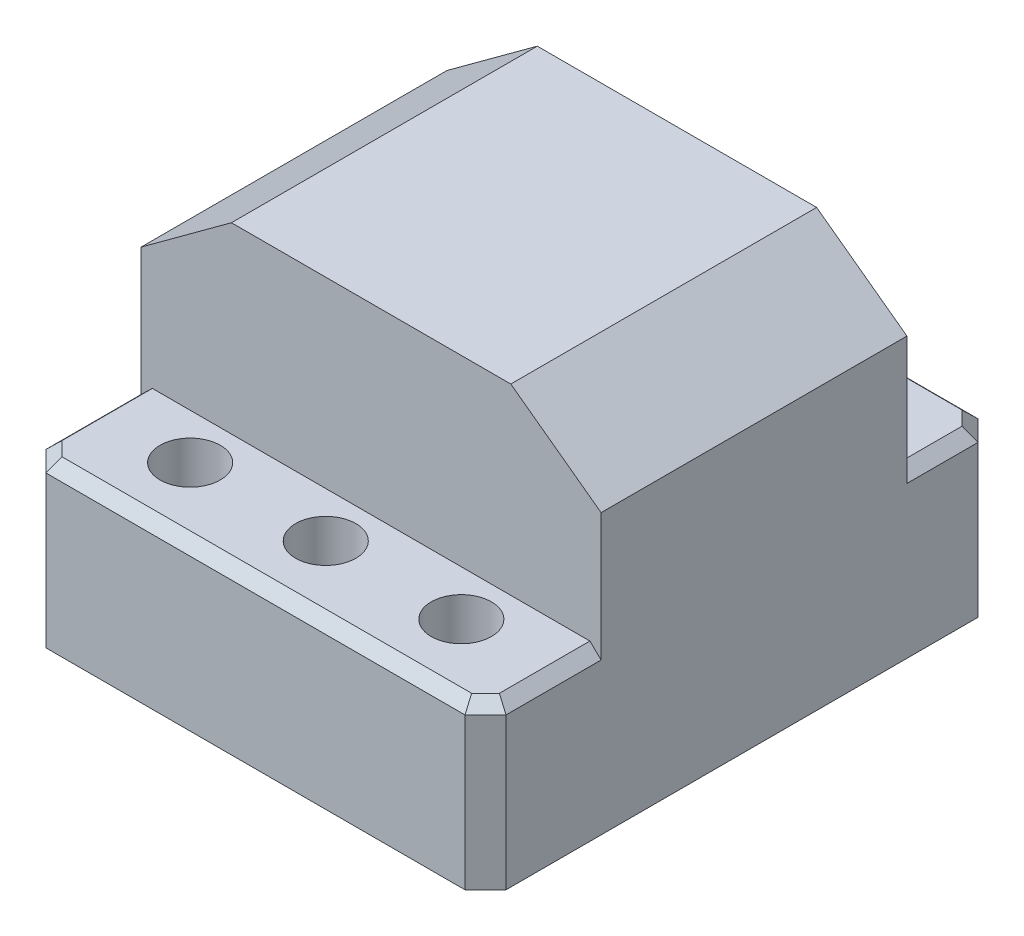
ISO-10303-21;
HEADER;
FILE_DESCRIPTION(('STEP AP214'),'2;1');
FILE_NAME('part.step','',(''),(''),'','','');
FILE_SCHEMA(('AUTOMOTIVE_DESIGN { 1 0 10303 214 1 1 1 1 }'));
ENDSEC;
DATA;
#1=APPLICATION_CONTEXT('core data for automotive mechanical design processes');
#2=APPLICATION_PROTOCOL_DEFINITION('international standard','automotive_design',2000,#1);
#3=PRODUCT_CONTEXT('',#1,'mechanical');
#4=PRODUCT('Part','Part','',(#3));
#5=PRODUCT_RELATED_PRODUCT_CATEGORY('part','',(#4));
#6=PRODUCT_DEFINITION_FORMATION('','',#4);
#7=PRODUCT_DEFINITION_CONTEXT('part definition',#1,'design');
#8=PRODUCT_DEFINITION('design','',#6,#7);
#9=PRODUCT_DEFINITION_SHAPE('','',#8);
#10=(LENGTH_UNIT() NAMED_UNIT(*) SI_UNIT(.MILLI.,.METRE.));
#11=(NAMED_UNIT(*) PLANE_ANGLE_UNIT() SI_UNIT($,.RADIAN.));
#12=(NAMED_UNIT(*) SI_UNIT($,.STERADIAN.) SOLID_ANGLE_UNIT());
#13=UNCERTAINTY_MEASURE_WITH_UNIT(LENGTH_MEASURE(1.E-05),#10,'distance_accuracy_value','');
#14=(GEOMETRIC_REPRESENTATION_CONTEXT(3) GLOBAL_UNCERTAINTY_ASSIGNED_CONTEXT((#13)) GLOBAL_UNIT_ASSIGNED_CONTEXT((#10,
#11,#12)) REPRESENTATION_CONTEXT('',''));
#15=CARTESIAN_POINT('',(0.,0.,0.));
#16=DIRECTION('',(0.,0.,1.));
#17=DIRECTION('',(1.,0.,0.));
#18=AXIS2_PLACEMENT_3D('',#15,#16,#17);
#19=CARTESIAN_POINT('',(0.,17.1196,0.));
#20=DIRECTION('',(0.,1.,0.));
#21=DIRECTION('',(0.,0.,1.));
#22=AXIS2_PLACEMENT_3D('',#19,#20,#21);
#23=PLANE('',#22);
#24=DIRECTION('',(-1.,0.,0.));
#25=VECTOR('',#24,1.);
#26=CARTESIAN_POINT('',(0.,17.1196,9.652));
#27=LINE('',#26,#25);
#28=CARTESIAN_POINT('',(47.3303888513374,17.1196,9.652));
#29=VERTEX_POINT('',#28);
#30=CARTESIAN_POINT('',(1.18361114866263,17.1196,9.652));
#31=VERTEX_POINT('',#30);
#32=EDGE_CURVE('E206',#29,#31,#27,.T.);
#33=ORIENTED_EDGE('',*,*,#32,.F.);
#34=DIRECTION('',(0.,0.,-1.));
#35=VECTOR('',#34,1.);
#36=CARTESIAN_POINT('',(47.3303888513374,17.1196,2.159));
#37=LINE('',#36,#35);
#38=CARTESIAN_POINT('',(47.3303888513374,17.1196,2.64926779035206));
#39=VERTEX_POINT('',#38);
#40=EDGE_CURVE('E281',#29,#39,#37,.T.);
#41=ORIENTED_EDGE('',*,*,#40,.T.);
#42=DIRECTION('',(-0.707106781186549,0.,-0.707106781186546));
#43=VECTOR('',#42,1.);
#44=CARTESIAN_POINT('',(22.3405605304926,17.1196,-22.3405605304926));
#45=LINE('',#44,#43);
#46=CARTESIAN_POINT('',(45.8647322096479,17.1196,1.18361114866263));
#47=VERTEX_POINT('',#46);
#48=EDGE_CURVE('E279',#39,#47,#45,.T.);
#49=ORIENTED_EDGE('',*,*,#48,.T.);
#50=DIRECTION('',(-1.,0.,0.));
#51=VECTOR('',#50,1.);
#52=CARTESIAN_POINT('',(2.159,17.1196,1.18361114866263));
#53=LINE('',#52,#51);
#54=CARTESIAN_POINT('',(2.64926779035206,17.1196,1.18361114866263));
#55=VERTEX_POINT('',#54);
#56=EDGE_CURVE('E277',#47,#55,#53,.T.);
#57=ORIENTED_EDGE('',*,*,#56,.T.);
#58=DIRECTION('',(-0.707106781186546,0.,0.707106781186549));
#59=VECTOR('',#58,1.);
#60=CARTESIAN_POINT('',(1.91643946950735,17.1196,1.91643946950735));
#61=LINE('',#60,#59);
#62=CARTESIAN_POINT('',(1.18361114866263,17.1196,2.64926779035207));
#63=VERTEX_POINT('',#62);
#64=EDGE_CURVE('E275',#55,#63,#61,.T.);
#65=ORIENTED_EDGE('',*,*,#64,.T.);
#66=DIRECTION('',(0.,0.,1.));
#67=VECTOR('',#66,1.);
#68=CARTESIAN_POINT('',(1.18361114866263,17.1196,9.652));
#69=LINE('',#68,#67);
#70=EDGE_CURVE('E273',#63,#31,#69,.T.);
#71=ORIENTED_EDGE('',*,*,#70,.T.);
#72=EDGE_LOOP('',(#33,#41,#49,#57,#65,#71));
#73=FACE_BOUND('',#72,.T.);
#74=ADVANCED_FACE('F37',(#73),#23,.T.);
#75=CARTESIAN_POINT('',(0.,17.1196,0.));
#76=DIRECTION('',(1.,0.,0.));
#77=DIRECTION('',(0.,0.,-1.));
#78=AXIS2_PLACEMENT_3D('',#75,#76,#77);
#79=PLANE('',#78);
#80=DIRECTION('',(0.,-1.,0.));
#81=VECTOR('',#80,1.);
#82=CARTESIAN_POINT('',(0.,36.4236,9.652));
#83=LINE('',#82,#81);
#84=CARTESIAN_POINT('',(0.,29.4386,9.652));
#85=VERTEX_POINT('',#84);
#86=CARTESIAN_POINT('',(0.,15.9766,9.652));
#87=VERTEX_POINT('',#86);
#88=EDGE_CURVE('E208',#85,#87,#83,.T.);
#89=ORIENTED_EDGE('',*,*,#88,.T.);
#90=DIRECTION('',(0.,0.,-1.));
#91=VECTOR('',#90,1.);
#92=CARTESIAN_POINT('',(0.,15.9766,2.15900000000001));
#93=LINE('',#92,#91);
#94=CARTESIAN_POINT('',(0.,15.9766,2.15900000000001));
#95=VERTEX_POINT('',#94);
#96=EDGE_CURVE('E298',#87,#95,#93,.T.);
#97=ORIENTED_EDGE('',*,*,#96,.T.);
#98=DIRECTION('',(0.,-1.,0.));
#99=VECTOR('',#98,1.);
#100=CARTESIAN_POINT('',(0.,17.1196,2.15900000000001));
#101=LINE('',#100,#99);
#102=CARTESIAN_POINT('',(0.,0.,2.15900000000001));
#103=VERTEX_POINT('',#102);
#104=EDGE_CURVE('E249',#95,#103,#101,.T.);
#105=ORIENTED_EDGE('',*,*,#104,.T.);
#106=DIRECTION('',(0.,0.,1.));
#107=VECTOR('',#106,1.);
#108=CARTESIAN_POINT('',(0.,0.,0.));
#109=LINE('',#108,#107);
#110=CARTESIAN_POINT('',(0.,0.,51.943));
#111=VERTEX_POINT('',#110);
#112=EDGE_CURVE('E227',#103,#111,#109,.T.);
#113=ORIENTED_EDGE('',*,*,#112,.T.);
#114=DIRECTION('',(0.,1.,0.));
#115=VECTOR('',#114,1.);
#116=CARTESIAN_POINT('',(0.,17.1196,51.943));
#117=LINE('',#116,#115);
#118=CARTESIAN_POINT('',(0.,15.9766,51.943));
#119=VERTEX_POINT('',#118);
#120=EDGE_CURVE('E246',#111,#119,#117,.T.);
#121=ORIENTED_EDGE('',*,*,#120,.T.);
#122=DIRECTION('',(0.,0.,-1.));
#123=VECTOR('',#122,1.);
#124=CARTESIAN_POINT('',(0.,15.9766,41.91));
#125=LINE('',#124,#123);
#126=CARTESIAN_POINT('',(0.,15.9766,41.91));
#127=VERTEX_POINT('',#126);
#128=EDGE_CURVE('E295',#119,#127,#125,.T.);
#129=ORIENTED_EDGE('',*,*,#128,.T.);
#130=DIRECTION('',(0.,-1.,0.));
#131=VECTOR('',#130,1.);
#132=CARTESIAN_POINT('',(0.,36.4236,41.91));
#133=LINE('',#132,#131);
#134=CARTESIAN_POINT('',(0.,29.4386,41.91));
#135=VERTEX_POINT('',#134);
#136=EDGE_CURVE('E225',#135,#127,#133,.T.);
#137=ORIENTED_EDGE('',*,*,#136,.F.);
#138=DIRECTION('',(0.,0.,-1.));
#139=VECTOR('',#138,1.);
#140=CARTESIAN_POINT('',(0.,29.4386,9.652));
#141=LINE('',#140,#139);
#142=EDGE_CURVE('E184',#135,#85,#141,.T.);
#143=ORIENTED_EDGE('',*,*,#142,.T.);
#144=EDGE_LOOP('',(#89,#97,#105,#113,#121,#129,#137,#143));
#145=FACE_BOUND('',#144,.T.);
#146=ADVANCED_FACE('F370',(#145),#79,.F.);
#147=CARTESIAN_POINT('',(0.,17.1196,54.102));
#148=DIRECTION('',(0.,0.,-1.));
#149=DIRECTION('',(-1.,0.,0.));
#150=AXIS2_PLACEMENT_3D('',#147,#148,#149);
#151=PLANE('',#150);
#152=DIRECTION('',(0.,1.,0.));
#153=VECTOR('',#152,1.);
#154=CARTESIAN_POINT('',(46.355,17.1196,54.102));
#155=LINE('',#154,#153);
#156=CARTESIAN_POINT('',(46.355,0.,54.102));
#157=VERTEX_POINT('',#156);
#158=CARTESIAN_POINT('',(46.355,15.9766,54.102));
#159=VERTEX_POINT('',#158);
#160=EDGE_CURVE('E271',#157,#159,#155,.T.);
#161=ORIENTED_EDGE('',*,*,#160,.T.);
#162=DIRECTION('',(-1.,0.,0.));
#163=VECTOR('',#162,1.);
#164=CARTESIAN_POINT('',(2.159,15.9766,54.102));
#165=LINE('',#164,#163);
#166=CARTESIAN_POINT('',(2.159,15.9766,54.102));
#167=VERTEX_POINT('',#166);
#168=EDGE_CURVE('E62',#159,#167,#165,.T.);
#169=ORIENTED_EDGE('',*,*,#168,.T.);
#170=DIRECTION('',(0.,-1.,0.));
#171=VECTOR('',#170,1.);
#172=CARTESIAN_POINT('',(2.159,17.1196,54.102));
#173=LINE('',#172,#171);
#174=CARTESIAN_POINT('',(2.159,0.,54.102));
#175=VERTEX_POINT('',#174);
#176=EDGE_CURVE('E269',#167,#175,#173,.T.);
#177=ORIENTED_EDGE('',*,*,#176,.T.);
#178=DIRECTION('',(1.,0.,0.));
#179=VECTOR('',#178,1.);
#180=CARTESIAN_POINT('',(0.,0.,54.102));
#181=LINE('',#180,#179);
#182=EDGE_CURVE('E230',#175,#157,#181,.T.);
#183=ORIENTED_EDGE('',*,*,#182,.T.);
#184=EDGE_LOOP('',(#161,#169,#177,#183));
#185=FACE_BOUND('',#184,.T.);
#186=ADVANCED_FACE('F380',(#185),#151,.F.);
#187=CARTESIAN_POINT('',(48.514,17.1196,0.));
#188=DIRECTION('',(-1.,0.,0.));
#189=DIRECTION('',(0.,0.,1.));
#190=AXIS2_PLACEMENT_3D('',#187,#188,#189);
#191=PLANE('',#190);
#192=DIRECTION('',(0.,1.,0.));
#193=VECTOR('',#192,1.);
#194=CARTESIAN_POINT('',(48.514,17.1196,2.159));
#195=LINE('',#194,#193);
#196=CARTESIAN_POINT('',(48.514,0.,2.159));
#197=VERTEX_POINT('',#196);
#198=CARTESIAN_POINT('',(48.514,15.9766,2.159));
#199=VERTEX_POINT('',#198);
#200=EDGE_CURVE('E266',#197,#199,#195,.T.);
#201=ORIENTED_EDGE('',*,*,#200,.T.);
#202=DIRECTION('',(0.,0.,1.));
#203=VECTOR('',#202,1.);
#204=CARTESIAN_POINT('',(48.514,15.9766,9.652));
#205=LINE('',#204,#203);
#206=CARTESIAN_POINT('',(48.514,15.9766,9.652));
#207=VERTEX_POINT('',#206);
#208=EDGE_CURVE('E286',#199,#207,#205,.T.);
#209=ORIENTED_EDGE('',*,*,#208,.T.);
#210=DIRECTION('',(0.,-1.,0.));
#211=VECTOR('',#210,1.);
#212=CARTESIAN_POINT('',(48.514,36.4236,9.652));
#213=LINE('',#212,#211);
#214=CARTESIAN_POINT('',(48.514,29.4386,9.652));
#215=VERTEX_POINT('',#214);
#216=EDGE_CURVE('E221',#215,#207,#213,.T.);
#217=ORIENTED_EDGE('',*,*,#216,.F.);
#218=DIRECTION('',(0.,0.,1.));
#219=VECTOR('',#218,1.);
#220=CARTESIAN_POINT('',(48.514,29.4386,41.91));
#221=LINE('',#220,#219);
#222=CARTESIAN_POINT('',(48.514,29.4386,41.91));
#223=VERTEX_POINT('',#222);
#224=EDGE_CURVE('E189',#215,#223,#221,.T.);
#225=ORIENTED_EDGE('',*,*,#224,.T.);
#226=DIRECTION('',(0.,-1.,0.));
#227=VECTOR('',#226,1.);
#228=CARTESIAN_POINT('',(48.514,36.4236,41.91));
#229=LINE('',#228,#227);
#230=CARTESIAN_POINT('',(48.514,15.9766,41.91));
#231=VERTEX_POINT('',#230);
#232=EDGE_CURVE('E223',#223,#231,#229,.T.);
#233=ORIENTED_EDGE('',*,*,#232,.T.);
#234=DIRECTION('',(0.,0.,1.));
#235=VECTOR('',#234,1.);
#236=CARTESIAN_POINT('',(48.514,15.9766,51.943));
#237=LINE('',#236,#235);
#238=CARTESIAN_POINT('',(48.514,15.9766,51.943));
#239=VERTEX_POINT('',#238);
#240=EDGE_CURVE('E284',#231,#239,#237,.T.);
#241=ORIENTED_EDGE('',*,*,#240,.T.);
#242=DIRECTION('',(0.,-1.,0.));
#243=VECTOR('',#242,1.);
#244=CARTESIAN_POINT('',(48.514,17.1196,51.943));
#245=LINE('',#244,#243);
#246=CARTESIAN_POINT('',(48.514,0.,51.943));
#247=VERTEX_POINT('',#246);
#248=EDGE_CURVE('E264',#239,#247,#245,.T.);
#249=ORIENTED_EDGE('',*,*,#248,.T.);
#250=DIRECTION('',(0.,0.,-1.));
#251=VECTOR('',#250,1.);
#252=CARTESIAN_POINT('',(48.514,0.,0.));
#253=LINE('',#252,#251);
#254=EDGE_CURVE('E233',#247,#197,#253,.T.);
#255=ORIENTED_EDGE('',*,*,#254,.T.);
#256=EDGE_LOOP('',(#201,#209,#217,#225,#233,#241,#249,#255));
#257=FACE_BOUND('',#256,.T.);
#258=ADVANCED_FACE('F385',(#257),#191,.F.);
#259=CARTESIAN_POINT('',(0.,17.1196,0.));
#260=DIRECTION('',(0.,0.,1.));
#261=DIRECTION('',(1.,0.,0.));
#262=AXIS2_PLACEMENT_3D('',#259,#260,#261);
#263=PLANE('',#262);
#264=DIRECTION('',(0.,1.,0.));
#265=VECTOR('',#264,1.);
#266=CARTESIAN_POINT('',(2.159,17.1196,0.));
#267=LINE('',#266,#265);
#268=CARTESIAN_POINT('',(2.159,0.,0.));
#269=VERTEX_POINT('',#268);
#270=CARTESIAN_POINT('',(2.159,15.9766,0.));
#271=VERTEX_POINT('',#270);
#272=EDGE_CURVE('E261',#269,#271,#267,.T.);
#273=ORIENTED_EDGE('',*,*,#272,.T.);
#274=DIRECTION('',(1.,0.,0.));
#275=VECTOR('',#274,1.);
#276=CARTESIAN_POINT('',(46.355,15.9766,0.));
#277=LINE('',#276,#275);
#278=CARTESIAN_POINT('',(46.355,15.9766,0.));
#279=VERTEX_POINT('',#278);
#280=EDGE_CURVE('E291',#271,#279,#277,.T.);
#281=ORIENTED_EDGE('',*,*,#280,.T.);
#282=DIRECTION('',(0.,-1.,0.));
#283=VECTOR('',#282,1.);
#284=CARTESIAN_POINT('',(46.355,17.1196,0.));
#285=LINE('',#284,#283);
#286=CARTESIAN_POINT('',(46.355,0.,0.));
#287=VERTEX_POINT('',#286);
#288=EDGE_CURVE('E259',#279,#287,#285,.T.);
#289=ORIENTED_EDGE('',*,*,#288,.T.);
#290=DIRECTION('',(-1.,0.,0.));
#291=VECTOR('',#290,1.);
#292=CARTESIAN_POINT('',(0.,0.,0.));
#293=LINE('',#292,#291);
#294=EDGE_CURVE('E201',#287,#269,#293,.T.);
#295=ORIENTED_EDGE('',*,*,#294,.T.);
#296=EDGE_LOOP('',(#273,#281,#289,#295));
#297=FACE_BOUND('',#296,.T.);
#298=ADVANCED_FACE('F426',(#297),#263,.F.);
#299=CARTESIAN_POINT('',(38.5572,17.1196,46.6953888513374));
#300=DIRECTION('',(0.,1.,0.));
#301=DIRECTION('',(0.,0.,1.));
#302=AXIS2_PLACEMENT_3D('',#299,#300,#301);
#303=CIRCLE('',#302,3.175);
#304=CARTESIAN_POINT('',(38.5572,17.1196,49.8703888513374));
#305=VERTEX_POINT('',#304);
#306=EDGE_CURVE('E486',#305,#305,#303,.T.);
#307=ORIENTED_EDGE('',*,*,#306,.F.);
#308=EDGE_LOOP('',(#307));
#309=FACE_BOUND('',#308,.T.);
#310=CARTESIAN_POINT('',(9.9568,17.1196,46.6953888513374));
#311=DIRECTION('',(0.,1.,0.));
#312=DIRECTION('',(0.,0.,1.));
#313=AXIS2_PLACEMENT_3D('',#310,#311,#312);
#314=CIRCLE('',#313,3.175);
#315=CARTESIAN_POINT('',(9.9568,17.1196,49.8703888513374));
#316=VERTEX_POINT('',#315);
#317=EDGE_CURVE('E493',#316,#316,#314,.T.);
#318=ORIENTED_EDGE('',*,*,#317,.F.);
#319=EDGE_LOOP('',(#318));
#320=FACE_BOUND('',#319,.T.);
#321=CARTESIAN_POINT('',(24.257,17.1196,46.6953888513374));
#322=DIRECTION('',(0.,1.,0.));
#323=DIRECTION('',(0.,0.,1.));
#324=AXIS2_PLACEMENT_3D('',#321,#322,#323);
#325=CIRCLE('',#324,3.175);
#326=CARTESIAN_POINT('',(24.257,17.1196,49.8703888513374));
#327=VERTEX_POINT('',#326);
#328=EDGE_CURVE('E214',#327,#327,#325,.T.);
#329=ORIENTED_EDGE('',*,*,#328,.F.);
#330=EDGE_LOOP('',(#329));
#331=FACE_BOUND('',#330,.T.);
#332=DIRECTION('',(1.,0.,0.));
#333=VECTOR('',#332,1.);
#334=CARTESIAN_POINT('',(0.,17.1196,41.91));
#335=LINE('',#334,#333);
#336=CARTESIAN_POINT('',(1.18361114866263,17.1196,41.91));
#337=VERTEX_POINT('',#336);
#338=CARTESIAN_POINT('',(47.3303888513374,17.1196,41.91));
#339=VERTEX_POINT('',#338);
#340=EDGE_CURVE('E211',#337,#339,#335,.T.);
#341=ORIENTED_EDGE('',*,*,#340,.F.);
#342=DIRECTION('',(0.,0.,1.));
#343=VECTOR('',#342,1.);
#344=CARTESIAN_POINT('',(1.18361114866263,17.1196,51.943));
#345=LINE('',#344,#343);
#346=CARTESIAN_POINT('',(1.18361114866263,17.1196,51.4527322096479));
#347=VERTEX_POINT('',#346);
#348=EDGE_CURVE('E308',#337,#347,#345,.T.);
#349=ORIENTED_EDGE('',*,*,#348,.T.);
#350=DIRECTION('',(0.707106781186546,0.,0.707106781186549));
#351=VECTOR('',#350,1.);
#352=CARTESIAN_POINT('',(-25.1345605304927,17.1196,25.1345605304926));
#353=LINE('',#352,#351);
#354=CARTESIAN_POINT('',(2.64926779035206,17.1196,52.9183888513374));
#355=VERTEX_POINT('',#354);
#356=EDGE_CURVE('E306',#347,#355,#353,.T.);
#357=ORIENTED_EDGE('',*,*,#356,.T.);
#358=DIRECTION('',(1.,0.,0.));
#359=VECTOR('',#358,1.);
#360=CARTESIAN_POINT('',(46.355,17.1196,52.9183888513374));
#361=LINE('',#360,#359);
#362=CARTESIAN_POINT('',(45.8647322096479,17.1196,52.9183888513374));
#363=VERTEX_POINT('',#362);
#364=EDGE_CURVE('E304',#355,#363,#361,.T.);
#365=ORIENTED_EDGE('',*,*,#364,.T.);
#366=DIRECTION('',(0.707106781186548,0.,-0.707106781186548));
#367=VECTOR('',#366,1.);
#368=CARTESIAN_POINT('',(49.3915605304927,17.1196,49.3915605304927));
#369=LINE('',#368,#367);
#370=CARTESIAN_POINT('',(47.3303888513374,17.1196,51.4527322096479));
#371=VERTEX_POINT('',#370);
#372=EDGE_CURVE('E302',#363,#371,#369,.T.);
#373=ORIENTED_EDGE('',*,*,#372,.T.);
#374=DIRECTION('',(0.,0.,-1.));
#375=VECTOR('',#374,1.);
#376=CARTESIAN_POINT('',(47.3303888513374,17.1196,41.91));
#377=LINE('',#376,#375);
#378=EDGE_CURVE('E300',#371,#339,#377,.T.);
#379=ORIENTED_EDGE('',*,*,#378,.T.);
#380=EDGE_LOOP('',(#341,#349,#357,#365,#373,#379));
#381=FACE_BOUND('',#380,.T.);
#382=ADVANCED_FACE('F352',(#309,#320,#331,#381),#23,.T.);
#383=CARTESIAN_POINT('',(0.,0.,0.));
#384=DIRECTION('',(0.,1.,0.));
#385=DIRECTION('',(0.,0.,1.));
#386=AXIS2_PLACEMENT_3D('',#383,#384,#385);
#387=PLANE('',#386);
#388=ORIENTED_EDGE('',*,*,#112,.F.);
#389=DIRECTION('',(-0.707106781186546,0.,0.707106781186549));
#390=VECTOR('',#389,1.);
#391=CARTESIAN_POINT('',(0.,0.,2.15900000000001));
#392=LINE('',#391,#390);
#393=EDGE_CURVE('E257',#103,#269,#392,.F.);
#394=ORIENTED_EDGE('',*,*,#393,.T.);
#395=ORIENTED_EDGE('',*,*,#294,.F.);
#396=DIRECTION('',(-0.707106781186549,0.,-0.707106781186546));
#397=VECTOR('',#396,1.);
#398=CARTESIAN_POINT('',(46.355,0.,0.));
#399=LINE('',#398,#397);
#400=EDGE_CURVE('E255',#287,#197,#399,.F.);
#401=ORIENTED_EDGE('',*,*,#400,.T.);
#402=ORIENTED_EDGE('',*,*,#254,.F.);
#403=DIRECTION('',(0.707106781186548,0.,-0.707106781186548));
#404=VECTOR('',#403,1.);
#405=CARTESIAN_POINT('',(48.514,0.,51.943));
#406=LINE('',#405,#404);
#407=EDGE_CURVE('E253',#247,#157,#406,.F.);
#408=ORIENTED_EDGE('',*,*,#407,.T.);
#409=ORIENTED_EDGE('',*,*,#182,.F.);
#410=DIRECTION('',(0.707106781186546,0.,0.707106781186549));
#411=VECTOR('',#410,1.);
#412=CARTESIAN_POINT('',(2.159,0.,54.102));
#413=LINE('',#412,#411);
#414=EDGE_CURVE('E251',#175,#111,#413,.F.);
#415=ORIENTED_EDGE('',*,*,#414,.T.);
#416=EDGE_LOOP('',(#388,#394,#395,#401,#402,#408,#409,#415));
#417=FACE_BOUND('',#416,.T.);
#418=ADVANCED_FACE('F375',(#417),#387,.F.);
#419=CARTESIAN_POINT('',(0.,36.4236,41.91));
#420=DIRECTION('',(0.,0.,-1.));
#421=DIRECTION('',(-1.,0.,0.));
#422=AXIS2_PLACEMENT_3D('',#419,#420,#421);
#423=PLANE('',#422);
#424=ORIENTED_EDGE('',*,*,#232,.F.);
#425=DIRECTION('',(-0.806404995855706,0.591363663627517,0.));
#426=VECTOR('',#425,1.);
#427=CARTESIAN_POINT('',(38.989,36.4236,41.91));
#428=LINE('',#427,#426);
#429=CARTESIAN_POINT('',(38.989,36.4236,41.91));
#430=VERTEX_POINT('',#429);
#431=EDGE_CURVE('E188',#223,#430,#428,.T.);
#432=ORIENTED_EDGE('',*,*,#431,.T.);
#433=DIRECTION('',(1.,0.,0.));
#434=VECTOR('',#433,1.);
#435=CARTESIAN_POINT('',(0.,36.4236,41.91));
#436=LINE('',#435,#434);
#437=CARTESIAN_POINT('',(9.52500000000005,36.4236,41.91));
#438=VERTEX_POINT('',#437);
#439=EDGE_CURVE('E196',#438,#430,#436,.T.);
#440=ORIENTED_EDGE('',*,*,#439,.F.);
#441=DIRECTION('',(-0.806404995855706,-0.591363663627517,0.));
#442=VECTOR('',#441,1.);
#443=CARTESIAN_POINT('',(9.52500000000005,36.4236,41.91));
#444=LINE('',#443,#442);
#445=EDGE_CURVE('E179',#438,#135,#444,.T.);
#446=ORIENTED_EDGE('',*,*,#445,.T.);
#447=ORIENTED_EDGE('',*,*,#136,.T.);
#448=DIRECTION('',(0.719339800338649,0.694658370459,0.));
#449=VECTOR('',#448,1.);
#450=CARTESIAN_POINT('',(10.2172721200297,25.8433049954621,41.91));
#451=LINE('',#450,#449);
#452=EDGE_CURVE('E47',#127,#337,#451,.T.);
#453=ORIENTED_EDGE('',*,*,#452,.T.);
#454=ORIENTED_EDGE('',*,*,#340,.T.);
#455=DIRECTION('',(0.719339800338649,-0.694658370459,0.));
#456=VECTOR('',#455,1.);
#457=CARTESIAN_POINT('',(13.1931707884579,50.0855282864643,41.91));
#458=LINE('',#457,#456);
#459=EDGE_CURVE('E11',#339,#231,#458,.T.);
#460=ORIENTED_EDGE('',*,*,#459,.T.);
#461=EDGE_LOOP('',(#424,#432,#440,#446,#447,#453,#454,#460));
#462=FACE_BOUND('',#461,.T.);
#463=ADVANCED_FACE('F204',(#462),#423,.F.);
#464=CARTESIAN_POINT('',(0.,36.4236,9.652));
#465=DIRECTION('',(0.,0.,1.));
#466=DIRECTION('',(1.,0.,0.));
#467=AXIS2_PLACEMENT_3D('',#464,#465,#466);
#468=PLANE('',#467);
#469=DIRECTION('',(-1.,0.,0.));
#470=VECTOR('',#469,1.);
#471=CARTESIAN_POINT('',(0.,36.4236,9.652));
#472=LINE('',#471,#470);
#473=CARTESIAN_POINT('',(38.989,36.4236,9.652));
#474=VERTEX_POINT('',#473);
#475=CARTESIAN_POINT('',(9.52500000000005,36.4236,9.652));
#476=VERTEX_POINT('',#475);
#477=EDGE_CURVE('E199',#474,#476,#472,.T.);
#478=ORIENTED_EDGE('',*,*,#477,.F.);
#479=DIRECTION('',(0.806404995855706,-0.591363663627517,0.));
#480=VECTOR('',#479,1.);
#481=CARTESIAN_POINT('',(38.989,36.4236,9.652));
#482=LINE('',#481,#480);
#483=EDGE_CURVE('E241',#474,#215,#482,.T.);
#484=ORIENTED_EDGE('',*,*,#483,.T.);
#485=ORIENTED_EDGE('',*,*,#216,.T.);
#486=DIRECTION('',(-0.719339800338649,0.694658370459,0.));
#487=VECTOR('',#486,1.);
#488=CARTESIAN_POINT('',(13.1931707884579,50.0855282864643,9.652));
#489=LINE('',#488,#487);
#490=EDGE_CURVE('E315',#207,#29,#489,.T.);
#491=ORIENTED_EDGE('',*,*,#490,.T.);
#492=ORIENTED_EDGE('',*,*,#32,.T.);
#493=DIRECTION('',(-0.719339800338649,-0.694658370459,0.));
#494=VECTOR('',#493,1.);
#495=CARTESIAN_POINT('',(10.2172721200297,25.843304995462,9.652));
#496=LINE('',#495,#494);
#497=EDGE_CURVE('E317',#31,#87,#496,.T.);
#498=ORIENTED_EDGE('',*,*,#497,.T.);
#499=ORIENTED_EDGE('',*,*,#88,.F.);
#500=DIRECTION('',(0.806404995855706,0.591363663627517,0.));
#501=VECTOR('',#500,1.);
#502=CARTESIAN_POINT('',(9.52500000000005,36.4236,9.652));
#503=LINE('',#502,#501);
#504=EDGE_CURVE('E239',#85,#476,#503,.T.);
#505=ORIENTED_EDGE('',*,*,#504,.T.);
#506=EDGE_LOOP('',(#478,#484,#485,#491,#492,#498,#499,#505));
#507=FACE_BOUND('',#506,.T.);
#508=ADVANCED_FACE('F405',(#507),#468,.F.);
#509=CARTESIAN_POINT('',(0.,36.4236,0.));
#510=DIRECTION('',(0.,1.,0.));
#511=DIRECTION('',(0.,0.,1.));
#512=AXIS2_PLACEMENT_3D('',#509,#510,#511);
#513=PLANE('',#512);
#514=ORIENTED_EDGE('',*,*,#439,.T.);
#515=DIRECTION('',(0.,0.,-1.));
#516=VECTOR('',#515,1.);
#517=CARTESIAN_POINT('',(38.989,36.4236,9.652));
#518=LINE('',#517,#516);
#519=EDGE_CURVE('E200',#430,#474,#518,.T.);
#520=ORIENTED_EDGE('',*,*,#519,.T.);
#521=ORIENTED_EDGE('',*,*,#477,.T.);
#522=DIRECTION('',(0.,0.,1.));
#523=VECTOR('',#522,1.);
#524=CARTESIAN_POINT('',(9.52500000000005,36.4236,41.91));
#525=LINE('',#524,#523);
#526=EDGE_CURVE('E183',#476,#438,#525,.T.);
#527=ORIENTED_EDGE('',*,*,#526,.T.);
#528=EDGE_LOOP('',(#514,#520,#521,#527));
#529=FACE_BOUND('',#528,.T.);
#530=ADVANCED_FACE('F194',(#529),#513,.T.);
#531=CARTESIAN_POINT('',(38.989,36.4236,0.));
#532=DIRECTION('',(0.591363663627517,0.806404995855706,0.));
#533=DIRECTION('',(0.,0.,1.));
#534=AXIS2_PLACEMENT_3D('',#531,#532,#533);
#535=PLANE('',#534);
#536=ORIENTED_EDGE('',*,*,#431,.F.);
#537=ORIENTED_EDGE('',*,*,#224,.F.);
#538=ORIENTED_EDGE('',*,*,#483,.F.);
#539=ORIENTED_EDGE('',*,*,#519,.F.);
#540=EDGE_LOOP('',(#536,#537,#538,#539));
#541=FACE_BOUND('',#540,.T.);
#542=ADVANCED_FACE('F404',(#541),#535,.T.);
#543=CARTESIAN_POINT('',(9.52500000000005,36.4236,0.));
#544=DIRECTION('',(-0.591363663627517,0.806404995855706,0.));
#545=DIRECTION('',(0.,0.,-1.));
#546=AXIS2_PLACEMENT_3D('',#543,#544,#545);
#547=PLANE('',#546);
#548=ORIENTED_EDGE('',*,*,#504,.F.);
#549=ORIENTED_EDGE('',*,*,#142,.F.);
#550=ORIENTED_EDGE('',*,*,#445,.F.);
#551=ORIENTED_EDGE('',*,*,#526,.F.);
#552=EDGE_LOOP('',(#548,#549,#550,#551));
#553=FACE_BOUND('',#552,.T.);
#554=ADVANCED_FACE('F182',(#553),#547,.T.);
#555=CARTESIAN_POINT('',(0.,17.1196,2.15900000000001));
#556=DIRECTION('',(0.707106781186549,0.,0.707106781186546));
#557=DIRECTION('',(0.,-1.,0.));
#558=AXIS2_PLACEMENT_3D('',#555,#556,#557);
#559=PLANE('',#558);
#560=ORIENTED_EDGE('',*,*,#104,.F.);
#561=DIRECTION('',(-0.707106781186546,0.,0.707106781186549));
#562=VECTOR('',#561,1.);
#563=CARTESIAN_POINT('',(0.,15.9766,2.15900000000001));
#564=LINE('',#563,#562);
#565=EDGE_CURVE('E293',#95,#271,#564,.F.);
#566=ORIENTED_EDGE('',*,*,#565,.T.);
#567=ORIENTED_EDGE('',*,*,#272,.F.);
#568=ORIENTED_EDGE('',*,*,#393,.F.);
#569=EDGE_LOOP('',(#560,#566,#567,#568));
#570=FACE_BOUND('',#569,.T.);
#571=ADVANCED_FACE('F412',(#570),#559,.F.);
#572=CARTESIAN_POINT('',(46.355,17.1196,0.));
#573=DIRECTION('',(-0.707106781186546,0.,0.707106781186549));
#574=DIRECTION('',(0.,-1.,0.));
#575=AXIS2_PLACEMENT_3D('',#572,#573,#574);
#576=PLANE('',#575);
#577=ORIENTED_EDGE('',*,*,#288,.F.);
#578=DIRECTION('',(-0.707106781186549,0.,-0.707106781186546));
#579=VECTOR('',#578,1.);
#580=CARTESIAN_POINT('',(46.355,15.9766,0.));
#581=LINE('',#580,#579);
#582=EDGE_CURVE('E289',#279,#199,#581,.F.);
#583=ORIENTED_EDGE('',*,*,#582,.T.);
#584=ORIENTED_EDGE('',*,*,#200,.F.);
#585=ORIENTED_EDGE('',*,*,#400,.F.);
#586=EDGE_LOOP('',(#577,#583,#584,#585));
#587=FACE_BOUND('',#586,.T.);
#588=ADVANCED_FACE('F389',(#587),#576,.F.);
#589=CARTESIAN_POINT('',(48.514,17.1196,51.943));
#590=DIRECTION('',(-0.707106781186548,0.,-0.707106781186548));
#591=DIRECTION('',(0.,-1.,0.));
#592=AXIS2_PLACEMENT_3D('',#589,#590,#591);
#593=PLANE('',#592);
#594=ORIENTED_EDGE('',*,*,#248,.F.);
#595=DIRECTION('',(0.707106781186548,0.,-0.707106781186548));
#596=VECTOR('',#595,1.);
#597=CARTESIAN_POINT('',(48.514,15.9766,51.943));
#598=LINE('',#597,#596);
#599=EDGE_CURVE('E55',#239,#159,#598,.F.);
#600=ORIENTED_EDGE('',*,*,#599,.T.);
#601=ORIENTED_EDGE('',*,*,#160,.F.);
#602=ORIENTED_EDGE('',*,*,#407,.F.);
#603=EDGE_LOOP('',(#594,#600,#601,#602));
#604=FACE_BOUND('',#603,.T.);
#605=ADVANCED_FACE('F381',(#604),#593,.F.);
#606=CARTESIAN_POINT('',(2.159,17.1196,54.102));
#607=DIRECTION('',(0.707106781186549,0.,-0.707106781186546));
#608=DIRECTION('',(0.,-1.,0.));
#609=AXIS2_PLACEMENT_3D('',#606,#607,#608);
#610=PLANE('',#609);
#611=ORIENTED_EDGE('',*,*,#176,.F.);
#612=DIRECTION('',(0.707106781186546,0.,0.707106781186549));
#613=VECTOR('',#612,1.);
#614=CARTESIAN_POINT('',(2.159,15.9766,54.102));
#615=LINE('',#614,#613);
#616=EDGE_CURVE('E311',#167,#119,#615,.F.);
#617=ORIENTED_EDGE('',*,*,#616,.T.);
#618=ORIENTED_EDGE('',*,*,#120,.F.);
#619=ORIENTED_EDGE('',*,*,#414,.F.);
#620=EDGE_LOOP('',(#611,#617,#618,#619));
#621=FACE_BOUND('',#620,.T.);
#622=ADVANCED_FACE('F367',(#621),#610,.F.);
#623=CARTESIAN_POINT('',(1.18361114866263,17.1196,0.));
#624=DIRECTION('',(-0.694658370459,0.719339800338649,0.));
#625=DIRECTION('',(0.,0.,-1.));
#626=AXIS2_PLACEMENT_3D('',#623,#624,#625);
#627=PLANE('',#626);
#628=ORIENTED_EDGE('',*,*,#497,.F.);
#629=ORIENTED_EDGE('',*,*,#70,.F.);
#630=DIRECTION('',(-0.689388373352398,-0.665734613628924,-0.285554013984889));
#631=VECTOR('',#630,1.);
#632=CARTESIAN_POINT('',(0.662082604115199,16.6159657387891,2.43324359403582));
#633=LINE('',#632,#631);
#634=EDGE_CURVE('E218',#95,#63,#633,.F.);
#635=ORIENTED_EDGE('',*,*,#634,.F.);
#636=ORIENTED_EDGE('',*,*,#96,.F.);
#637=EDGE_LOOP('',(#628,#629,#635,#636));
#638=FACE_BOUND('',#637,.T.);
#639=ADVANCED_FACE('F416',(#638),#627,.T.);
#640=CARTESIAN_POINT('',(1.91643946950735,17.1196,1.91643946950735));
#641=DIRECTION('',(-0.491197644359557,0.719339800338649,-0.491197644359555));
#642=DIRECTION('',(0.707106781186546,0.,-0.707106781186549));
#643=AXIS2_PLACEMENT_3D('',#640,#641,#642);
#644=PLANE('',#643);
#645=ORIENTED_EDGE('',*,*,#634,.T.);
#646=ORIENTED_EDGE('',*,*,#64,.F.);
#647=DIRECTION('',(-0.285554013984891,-0.665734613628924,-0.689388373352398));
#648=VECTOR('',#647,1.);
#649=CARTESIAN_POINT('',(2.73377500375659,17.3166183373703,1.3876296093822));
#650=LINE('',#649,#648);
#651=EDGE_CURVE('E326',#271,#55,#650,.F.);
#652=ORIENTED_EDGE('',*,*,#651,.F.);
#653=ORIENTED_EDGE('',*,*,#565,.F.);
#654=EDGE_LOOP('',(#645,#646,#652,#653));
#655=FACE_BOUND('',#654,.T.);
#656=ADVANCED_FACE('F420',(#655),#644,.T.);
#657=CARTESIAN_POINT('',(0.,17.1196,1.18361114866263));
#658=DIRECTION('',(0.,0.719339800338649,-0.694658370459));
#659=DIRECTION('',(1.,0.,0.));
#660=AXIS2_PLACEMENT_3D('',#657,#658,#659);
#661=PLANE('',#660);
#662=ORIENTED_EDGE('',*,*,#651,.T.);
#663=ORIENTED_EDGE('',*,*,#56,.F.);
#664=DIRECTION('',(0.285554013984889,-0.665734613628924,-0.689388373352398));
#665=VECTOR('',#664,1.);
#666=CARTESIAN_POINT('',(42.1248717278457,25.8386319552308,10.2124330452127));
#667=LINE('',#666,#665);
#668=EDGE_CURVE('E323',#279,#47,#667,.F.);
#669=ORIENTED_EDGE('',*,*,#668,.F.);
#670=ORIENTED_EDGE('',*,*,#280,.F.);
#671=EDGE_LOOP('',(#662,#663,#669,#670));
#672=FACE_BOUND('',#671,.T.);
#673=ADVANCED_FACE('F424',(#672),#661,.T.);
#674=CARTESIAN_POINT('',(22.3405605304926,17.1196,-22.3405605304926));
#675=DIRECTION('',(0.491197644359555,0.719339800338649,-0.491197644359557));
#676=DIRECTION('',(0.707106781186549,0.,0.707106781186546));
#677=AXIS2_PLACEMENT_3D('',#674,#675,#676);
#678=PLANE('',#677);
#679=ORIENTED_EDGE('',*,*,#668,.T.);
#680=ORIENTED_EDGE('',*,*,#48,.F.);
#681=DIRECTION('',(0.689388373352398,-0.665734613628923,-0.285554013984891));
#682=VECTOR('',#681,1.);
#683=CARTESIAN_POINT('',(40.3732528310098,23.8380281596363,5.53100788524612));
#684=LINE('',#683,#682);
#685=EDGE_CURVE('E321',#199,#39,#684,.F.);
#686=ORIENTED_EDGE('',*,*,#685,.F.);
#687=ORIENTED_EDGE('',*,*,#582,.F.);
#688=EDGE_LOOP('',(#679,#680,#686,#687));
#689=FACE_BOUND('',#688,.T.);
#690=ADVANCED_FACE('F394',(#689),#678,.T.);
#691=CARTESIAN_POINT('',(47.3303888513374,17.1196,0.));
#692=DIRECTION('',(0.694658370459,0.719339800338649,0.));
#693=DIRECTION('',(0.,0.,1.));
#694=AXIS2_PLACEMENT_3D('',#691,#692,#693);
#695=PLANE('',#694);
#696=ORIENTED_EDGE('',*,*,#490,.F.);
#697=ORIENTED_EDGE('',*,*,#208,.F.);
#698=ORIENTED_EDGE('',*,*,#685,.T.);
#699=ORIENTED_EDGE('',*,*,#40,.F.);
#700=EDGE_LOOP('',(#696,#697,#698,#699));
#701=FACE_BOUND('',#700,.T.);
#702=ADVANCED_FACE('F399',(#701),#695,.T.);
#703=CARTESIAN_POINT('',(47.3303888513374,17.1196,0.));
#704=DIRECTION('',(0.694658370459,0.719339800338649,0.));
#705=DIRECTION('',(0.,0.,1.));
#706=AXIS2_PLACEMENT_3D('',#703,#704,#705);
#707=PLANE('',#706);
#708=ORIENTED_EDGE('',*,*,#459,.F.);
#709=ORIENTED_EDGE('',*,*,#378,.F.);
#710=DIRECTION('',(0.689388373352399,-0.665734613628924,0.285554013984886));
#711=VECTOR('',#710,1.);
#712=CARTESIAN_POINT('',(37.2015265898443,26.900928587491,47.2572200895285));
#713=LINE('',#712,#711);
#714=EDGE_CURVE('E42',#239,#371,#713,.F.);
#715=ORIENTED_EDGE('',*,*,#714,.F.);
#716=ORIENTED_EDGE('',*,*,#240,.F.);
#717=EDGE_LOOP('',(#708,#709,#715,#716));
#718=FACE_BOUND('',#717,.T.);
#719=ADVANCED_FACE('F40',(#718),#707,.T.);
#720=CARTESIAN_POINT('',(49.3915605304927,17.1196,49.3915605304927));
#721=DIRECTION('',(0.491197644359557,0.719339800338647,0.491197644359557));
#722=DIRECTION('',(-0.707106781186548,0.,0.707106781186548));
#723=AXIS2_PLACEMENT_3D('',#720,#721,#722);
#724=PLANE('',#723);
#725=ORIENTED_EDGE('',*,*,#714,.T.);
#726=ORIENTED_EDGE('',*,*,#372,.F.);
#727=DIRECTION('',(0.285554013984886,-0.665734613628924,0.689388373352399));
#728=VECTOR('',#727,1.);
#729=CARTESIAN_POINT('',(45.4580306329305,18.0677754896732,51.9365243889876));
#730=LINE('',#729,#728);
#731=EDGE_CURVE('E336',#159,#363,#730,.F.);
#732=ORIENTED_EDGE('',*,*,#731,.F.);
#733=ORIENTED_EDGE('',*,*,#599,.F.);
#734=EDGE_LOOP('',(#725,#726,#732,#733));
#735=FACE_BOUND('',#734,.T.);
#736=ADVANCED_FACE('F345',(#735),#724,.T.);
#737=CARTESIAN_POINT('',(0.,17.1196,52.9183888513374));
#738=DIRECTION('',(0.,0.719339800338649,0.694658370459));
#739=DIRECTION('',(-1.,0.,0.));
#740=AXIS2_PLACEMENT_3D('',#737,#738,#739);
#741=PLANE('',#740);
#742=ORIENTED_EDGE('',*,*,#731,.T.);
#743=ORIENTED_EDGE('',*,*,#364,.F.);
#744=DIRECTION('',(-0.285554013984888,-0.665734613628924,0.689388373352398));
#745=VECTOR('',#744,1.);
#746=CARTESIAN_POINT('',(2.43324359403581,16.6159657387891,53.4399173958848));
#747=LINE('',#746,#745);
#748=EDGE_CURVE('E333',#167,#355,#747,.F.);
#749=ORIENTED_EDGE('',*,*,#748,.F.);
#750=ORIENTED_EDGE('',*,*,#168,.F.);
#751=EDGE_LOOP('',(#742,#743,#749,#750));
#752=FACE_BOUND('',#751,.T.);
#753=ADVANCED_FACE('F362',(#752),#741,.T.);
#754=CARTESIAN_POINT('',(-25.1345605304927,17.1196,25.1345605304926));
#755=DIRECTION('',(-0.491197644359557,0.719339800338648,0.491197644359556));
#756=DIRECTION('',(-0.707106781186546,0.,-0.707106781186549));
#757=AXIS2_PLACEMENT_3D('',#754,#755,#756);
#758=PLANE('',#757);
#759=ORIENTED_EDGE('',*,*,#748,.T.);
#760=ORIENTED_EDGE('',*,*,#356,.F.);
#761=DIRECTION('',(-0.689388373352398,-0.665734613628924,0.285554013984887));
#762=VECTOR('',#761,1.);
#763=CARTESIAN_POINT('',(-6.14333395185608,10.0440513628013,54.4876522410459));
#764=LINE('',#763,#762);
#765=EDGE_CURVE('E331',#119,#347,#764,.F.);
#766=ORIENTED_EDGE('',*,*,#765,.F.);
#767=ORIENTED_EDGE('',*,*,#616,.F.);
#768=EDGE_LOOP('',(#759,#760,#766,#767));
#769=FACE_BOUND('',#768,.T.);
#770=ADVANCED_FACE('F364',(#769),#758,.T.);
#771=CARTESIAN_POINT('',(1.18361114866262,17.1196,0.));
#772=DIRECTION('',(-0.694658370459,0.719339800338649,0.));
#773=DIRECTION('',(0.,0.,-1.));
#774=AXIS2_PLACEMENT_3D('',#771,#772,#773);
#775=PLANE('',#774);
#776=ORIENTED_EDGE('',*,*,#452,.F.);
#777=ORIENTED_EDGE('',*,*,#128,.F.);
#778=ORIENTED_EDGE('',*,*,#765,.T.);
#779=ORIENTED_EDGE('',*,*,#348,.F.);
#780=EDGE_LOOP('',(#776,#777,#778,#779));
#781=FACE_BOUND('',#780,.T.);
#782=ADVANCED_FACE('F357',(#781),#775,.T.);
#783=CARTESIAN_POINT('',(24.257,12.0396,46.6953888513374));
#784=DIRECTION('',(0.,1.,0.));
#785=DIRECTION('',(0.,0.,1.));
#786=AXIS2_PLACEMENT_3D('',#783,#784,#785);
#787=CYLINDRICAL_SURFACE('',#786,3.175);
#788=CARTESIAN_POINT('',(24.257,12.0396,46.6953888513374));
#789=DIRECTION('',(0.,1.,0.));
#790=DIRECTION('',(0.,0.,1.));
#791=AXIS2_PLACEMENT_3D('',#788,#789,#790);
#792=CIRCLE('',#791,3.175);
#793=CARTESIAN_POINT('',(24.257,12.0396,49.8703888513374));
#794=VERTEX_POINT('',#793);
#795=EDGE_CURVE('E334',#794,#794,#792,.T.);
#796=ORIENTED_EDGE('',*,*,#795,.F.);
#797=EDGE_LOOP('',(#796));
#798=FACE_BOUND('',#797,.T.);
#799=ORIENTED_EDGE('',*,*,#328,.T.);
#800=EDGE_LOOP('',(#799));
#801=FACE_BOUND('',#800,.T.);
#802=ADVANCED_FACE('F458',(#798,#801),#787,.F.);
#803=CARTESIAN_POINT('',(24.257,12.0396,46.6953888513374));
#804=DIRECTION('',(0.,1.,0.));
#805=DIRECTION('',(0.,0.,1.));
#806=AXIS2_PLACEMENT_3D('',#803,#804,#805);
#807=PLANE('',#806);
#808=ORIENTED_EDGE('',*,*,#795,.T.);
#809=EDGE_LOOP('',(#808));
#810=FACE_BOUND('',#809,.T.);
#811=ADVANCED_FACE('F461',(#810),#807,.T.);
#812=CARTESIAN_POINT('',(9.9568,12.0396,46.6953888513374));
#813=DIRECTION('',(0.,1.,0.));
#814=DIRECTION('',(0.,0.,1.));
#815=AXIS2_PLACEMENT_3D('',#812,#813,#814);
#816=CYLINDRICAL_SURFACE('',#815,3.175);
#817=CARTESIAN_POINT('',(9.9568,12.0396,46.6953888513374));
#818=DIRECTION('',(0.,1.,0.));
#819=DIRECTION('',(0.,0.,1.));
#820=AXIS2_PLACEMENT_3D('',#817,#818,#819);
#821=CIRCLE('',#820,3.175);
#822=CARTESIAN_POINT('',(9.9568,12.0396,49.8703888513374));
#823=VERTEX_POINT('',#822);
#824=EDGE_CURVE('E490',#823,#823,#821,.T.);
#825=ORIENTED_EDGE('',*,*,#824,.F.);
#826=EDGE_LOOP('',(#825));
#827=FACE_BOUND('',#826,.T.);
#828=ORIENTED_EDGE('',*,*,#317,.T.);
#829=EDGE_LOOP('',(#828));
#830=FACE_BOUND('',#829,.T.);
#831=ADVANCED_FACE('F465',(#827,#830),#816,.F.);
#832=CARTESIAN_POINT('',(9.9568,12.0396,46.6953888513374));
#833=DIRECTION('',(0.,1.,0.));
#834=DIRECTION('',(0.,0.,1.));
#835=AXIS2_PLACEMENT_3D('',#832,#833,#834);
#836=PLANE('',#835);
#837=ORIENTED_EDGE('',*,*,#824,.T.);
#838=EDGE_LOOP('',(#837));
#839=FACE_BOUND('',#838,.T.);
#840=ADVANCED_FACE('F469',(#839),#836,.T.);
#841=CARTESIAN_POINT('',(38.5572,12.0396,46.6953888513374));
#842=DIRECTION('',(0.,1.,0.));
#843=DIRECTION('',(0.,0.,1.));
#844=AXIS2_PLACEMENT_3D('',#841,#842,#843);
#845=CYLINDRICAL_SURFACE('',#844,3.175);
#846=CARTESIAN_POINT('',(38.5572,12.0396,46.6953888513374));
#847=DIRECTION('',(0.,1.,0.));
#848=DIRECTION('',(0.,0.,1.));
#849=AXIS2_PLACEMENT_3D('',#846,#847,#848);
#850=CIRCLE('',#849,3.175);
#851=CARTESIAN_POINT('',(38.5572,12.0396,49.8703888513374));
#852=VERTEX_POINT('',#851);
#853=EDGE_CURVE('E485',#852,#852,#850,.T.);
#854=ORIENTED_EDGE('',*,*,#853,.F.);
#855=EDGE_LOOP('',(#854));
#856=FACE_BOUND('',#855,.T.);
#857=ORIENTED_EDGE('',*,*,#306,.T.);
#858=EDGE_LOOP('',(#857));
#859=FACE_BOUND('',#858,.T.);
#860=ADVANCED_FACE('F473',(#856,#859),#845,.F.);
#861=CARTESIAN_POINT('',(38.5572,12.0396,46.6953888513374));
#862=DIRECTION('',(0.,1.,0.));
#863=DIRECTION('',(0.,0.,1.));
#864=AXIS2_PLACEMENT_3D('',#861,#862,#863);
#865=PLANE('',#864);
#866=ORIENTED_EDGE('',*,*,#853,.T.);
#867=EDGE_LOOP('',(#866));
#868=FACE_BOUND('',#867,.T.);
#869=ADVANCED_FACE('F477',(#868),#865,.T.);
#870=CLOSED_SHELL('',(#74,#146,#186,#258,#298,#382,#418,#463,#508,#530,#542,#554,#571,#588,#605,
#622,#639,#656,#673,#690,#702,#719,#736,#753,#770,#782,#802,#811,#831,#840,#860,#869));
#871=MANIFOLD_SOLID_BREP('B2',#870);
#872=ADVANCED_BREP_SHAPE_REPRESENTATION('',(#18,#871),#14);
#873=SHAPE_DEFINITION_REPRESENTATION(#9,#872);
ENDSEC;
END-ISO-10303-21;
